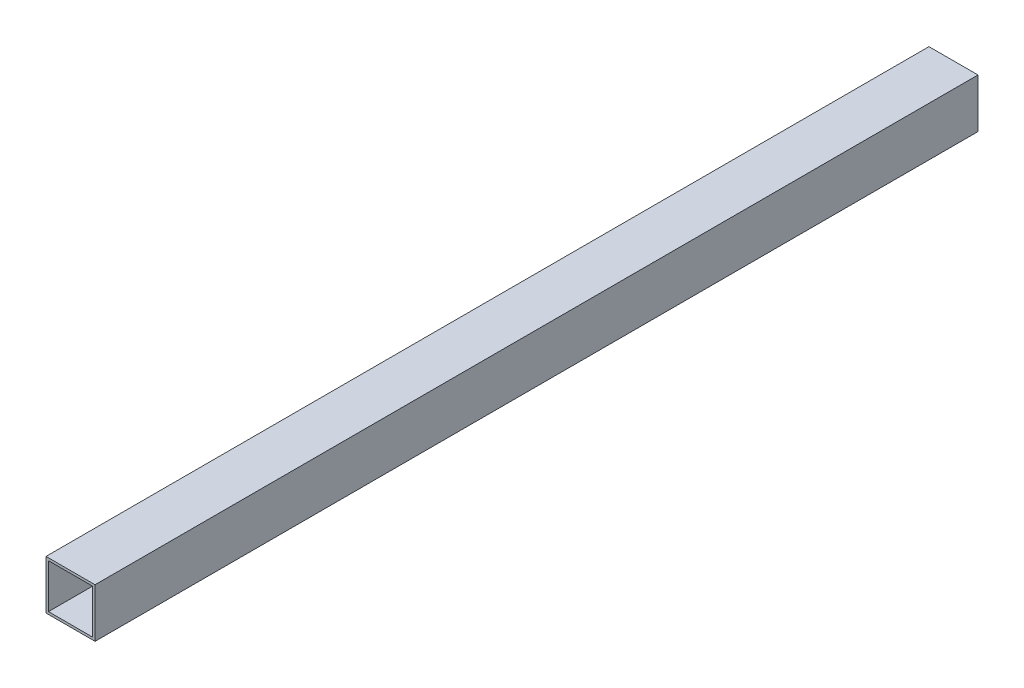
ISO-10303-21;
HEADER;
FILE_DESCRIPTION(('STEP AP214'),'2;1');
FILE_NAME('part.step','',(''),(''),'','','');
FILE_SCHEMA(('AUTOMOTIVE_DESIGN { 1 0 10303 214 1 1 1 1 }'));
ENDSEC;
DATA;
#1=APPLICATION_CONTEXT('core data for automotive mechanical design processes');
#2=APPLICATION_PROTOCOL_DEFINITION('international standard','automotive_design',2000,#1);
#3=PRODUCT_CONTEXT('',#1,'mechanical');
#4=PRODUCT('Part','Part','',(#3));
#5=PRODUCT_RELATED_PRODUCT_CATEGORY('part','',(#4));
#6=PRODUCT_DEFINITION_FORMATION('','',#4);
#7=PRODUCT_DEFINITION_CONTEXT('part definition',#1,'design');
#8=PRODUCT_DEFINITION('design','',#6,#7);
#9=PRODUCT_DEFINITION_SHAPE('','',#8);
#10=(LENGTH_UNIT() NAMED_UNIT(*) SI_UNIT(.MILLI.,.METRE.));
#11=(NAMED_UNIT(*) PLANE_ANGLE_UNIT() SI_UNIT($,.RADIAN.));
#12=(NAMED_UNIT(*) SI_UNIT($,.STERADIAN.) SOLID_ANGLE_UNIT());
#13=UNCERTAINTY_MEASURE_WITH_UNIT(LENGTH_MEASURE(1.E-05),#10,'distance_accuracy_value','');
#14=(GEOMETRIC_REPRESENTATION_CONTEXT(3) GLOBAL_UNCERTAINTY_ASSIGNED_CONTEXT((#13)) GLOBAL_UNIT_ASSIGNED_CONTEXT((#10,
#11,#12)) REPRESENTATION_CONTEXT('',''));
#15=CARTESIAN_POINT('',(0.,0.,0.));
#16=DIRECTION('',(0.,0.,1.));
#17=DIRECTION('',(1.,0.,0.));
#18=AXIS2_PLACEMENT_3D('',#15,#16,#17);
#19=CARTESIAN_POINT('',(0.,0.,360.));
#20=DIRECTION('',(0.,0.,1.));
#21=DIRECTION('',(1.,0.,0.));
#22=AXIS2_PLACEMENT_3D('',#19,#20,#21);
#23=PLANE('',#22);
#24=DIRECTION('',(0.,-1.,0.));
#25=VECTOR('',#24,1.);
#26=CARTESIAN_POINT('',(0.,0.,360.));
#27=LINE('',#26,#25);
#28=CARTESIAN_POINT('',(0.,0.,360.));
#29=VERTEX_POINT('',#28);
#30=CARTESIAN_POINT('',(0.,-20.,360.));
#31=VERTEX_POINT('',#30);
#32=EDGE_CURVE('E133',#29,#31,#27,.T.);
#33=ORIENTED_EDGE('',*,*,#32,.T.);
#34=DIRECTION('',(1.,0.,0.));
#35=VECTOR('',#34,1.);
#36=CARTESIAN_POINT('',(0.,-20.,360.));
#37=LINE('',#36,#35);
#38=CARTESIAN_POINT('',(20.,-20.,360.));
#39=VERTEX_POINT('',#38);
#40=EDGE_CURVE('E136',#31,#39,#37,.T.);
#41=ORIENTED_EDGE('',*,*,#40,.T.);
#42=DIRECTION('',(0.,1.,0.));
#43=VECTOR('',#42,1.);
#44=CARTESIAN_POINT('',(20.,0.,360.));
#45=LINE('',#44,#43);
#46=CARTESIAN_POINT('',(20.,0.,360.));
#47=VERTEX_POINT('',#46);
#48=EDGE_CURVE('E139',#39,#47,#45,.T.);
#49=ORIENTED_EDGE('',*,*,#48,.T.);
#50=DIRECTION('',(-1.,0.,0.));
#51=VECTOR('',#50,1.);
#52=CARTESIAN_POINT('',(0.,0.,360.));
#53=LINE('',#52,#51);
#54=EDGE_CURVE('E141',#47,#29,#53,.T.);
#55=ORIENTED_EDGE('',*,*,#54,.T.);
#56=EDGE_LOOP('',(#33,#41,#49,#55));
#57=FACE_BOUND('',#56,.T.);
#58=DIRECTION('',(-1.,0.,0.));
#59=VECTOR('',#58,1.);
#60=CARTESIAN_POINT('',(1.,-1.,360.));
#61=LINE('',#60,#59);
#62=CARTESIAN_POINT('',(19.,-1.,360.));
#63=VERTEX_POINT('',#62);
#64=CARTESIAN_POINT('',(1.,-1.,360.));
#65=VERTEX_POINT('',#64);
#66=EDGE_CURVE('E105',#63,#65,#61,.T.);
#67=ORIENTED_EDGE('',*,*,#66,.F.);
#68=DIRECTION('',(0.,1.,0.));
#69=VECTOR('',#68,1.);
#70=CARTESIAN_POINT('',(19.,-19.,360.));
#71=LINE('',#70,#69);
#72=CARTESIAN_POINT('',(19.,-19.,360.));
#73=VERTEX_POINT('',#72);
#74=EDGE_CURVE('E97',#73,#63,#71,.T.);
#75=ORIENTED_EDGE('',*,*,#74,.F.);
#76=DIRECTION('',(1.,0.,0.));
#77=VECTOR('',#76,1.);
#78=CARTESIAN_POINT('',(1.,-19.,360.));
#79=LINE('',#78,#77);
#80=CARTESIAN_POINT('',(1.,-19.,360.));
#81=VERTEX_POINT('',#80);
#82=EDGE_CURVE('E119',#81,#73,#79,.T.);
#83=ORIENTED_EDGE('',*,*,#82,.F.);
#84=DIRECTION('',(0.,-1.,0.));
#85=VECTOR('',#84,1.);
#86=CARTESIAN_POINT('',(1.,-19.,360.));
#87=LINE('',#86,#85);
#88=EDGE_CURVE('E117',#65,#81,#87,.T.);
#89=ORIENTED_EDGE('',*,*,#88,.F.);
#90=EDGE_LOOP('',(#67,#75,#83,#89));
#91=FACE_BOUND('',#90,.T.);
#92=ADVANCED_FACE('F32',(#57,#91),#23,.T.);
#93=CARTESIAN_POINT('',(0.,0.,0.));
#94=DIRECTION('',(0.,0.,1.));
#95=DIRECTION('',(1.,0.,0.));
#96=AXIS2_PLACEMENT_3D('',#93,#94,#95);
#97=PLANE('',#96);
#98=DIRECTION('',(0.,-1.,0.));
#99=VECTOR('',#98,1.);
#100=CARTESIAN_POINT('',(0.,0.,0.));
#101=LINE('',#100,#99);
#102=CARTESIAN_POINT('',(0.,0.,0.));
#103=VERTEX_POINT('',#102);
#104=CARTESIAN_POINT('',(0.,-20.,0.));
#105=VERTEX_POINT('',#104);
#106=EDGE_CURVE('E113',#103,#105,#101,.T.);
#107=ORIENTED_EDGE('',*,*,#106,.F.);
#108=DIRECTION('',(-1.,0.,0.));
#109=VECTOR('',#108,1.);
#110=CARTESIAN_POINT('',(0.,0.,0.));
#111=LINE('',#110,#109);
#112=CARTESIAN_POINT('',(20.,0.,0.));
#113=VERTEX_POINT('',#112);
#114=EDGE_CURVE('E137',#113,#103,#111,.T.);
#115=ORIENTED_EDGE('',*,*,#114,.F.);
#116=DIRECTION('',(0.,1.,0.));
#117=VECTOR('',#116,1.);
#118=CARTESIAN_POINT('',(20.,0.,0.));
#119=LINE('',#118,#117);
#120=CARTESIAN_POINT('',(20.,-20.,0.));
#121=VERTEX_POINT('',#120);
#122=EDGE_CURVE('E148',#121,#113,#119,.T.);
#123=ORIENTED_EDGE('',*,*,#122,.F.);
#124=DIRECTION('',(1.,0.,0.));
#125=VECTOR('',#124,1.);
#126=CARTESIAN_POINT('',(0.,-20.,0.));
#127=LINE('',#126,#125);
#128=EDGE_CURVE('E146',#105,#121,#127,.T.);
#129=ORIENTED_EDGE('',*,*,#128,.F.);
#130=EDGE_LOOP('',(#107,#115,#123,#129));
#131=FACE_BOUND('',#130,.T.);
#132=DIRECTION('',(0.,1.,0.));
#133=VECTOR('',#132,1.);
#134=CARTESIAN_POINT('',(19.,-19.,0.));
#135=LINE('',#134,#133);
#136=CARTESIAN_POINT('',(19.,-19.,0.));
#137=VERTEX_POINT('',#136);
#138=CARTESIAN_POINT('',(19.,-1.,0.));
#139=VERTEX_POINT('',#138);
#140=EDGE_CURVE('E55',#137,#139,#135,.T.);
#141=ORIENTED_EDGE('',*,*,#140,.T.);
#142=DIRECTION('',(-1.,0.,0.));
#143=VECTOR('',#142,1.);
#144=CARTESIAN_POINT('',(1.,-1.,0.));
#145=LINE('',#144,#143);
#146=CARTESIAN_POINT('',(1.,-1.,0.));
#147=VERTEX_POINT('',#146);
#148=EDGE_CURVE('E112',#139,#147,#145,.T.);
#149=ORIENTED_EDGE('',*,*,#148,.T.);
#150=DIRECTION('',(0.,-1.,0.));
#151=VECTOR('',#150,1.);
#152=CARTESIAN_POINT('',(1.,-19.,0.));
#153=LINE('',#152,#151);
#154=CARTESIAN_POINT('',(1.,-19.,0.));
#155=VERTEX_POINT('',#154);
#156=EDGE_CURVE('E125',#147,#155,#153,.T.);
#157=ORIENTED_EDGE('',*,*,#156,.T.);
#158=DIRECTION('',(1.,0.,0.));
#159=VECTOR('',#158,1.);
#160=CARTESIAN_POINT('',(1.,-19.,0.));
#161=LINE('',#160,#159);
#162=EDGE_CURVE('E106',#155,#137,#161,.T.);
#163=ORIENTED_EDGE('',*,*,#162,.T.);
#164=EDGE_LOOP('',(#141,#149,#157,#163));
#165=FACE_BOUND('',#164,.T.);
#166=ADVANCED_FACE('F166',(#131,#165),#97,.F.);
#167=CARTESIAN_POINT('',(0.,0.,360.));
#168=DIRECTION('',(1.,0.,0.));
#169=DIRECTION('',(0.,0.,-1.));
#170=AXIS2_PLACEMENT_3D('',#167,#168,#169);
#171=PLANE('',#170);
#172=ORIENTED_EDGE('',*,*,#106,.T.);
#173=DIRECTION('',(0.,0.,-1.));
#174=VECTOR('',#173,1.);
#175=CARTESIAN_POINT('',(0.,-20.,360.));
#176=LINE('',#175,#174);
#177=EDGE_CURVE('E11',#31,#105,#176,.T.);
#178=ORIENTED_EDGE('',*,*,#177,.F.);
#179=ORIENTED_EDGE('',*,*,#32,.F.);
#180=DIRECTION('',(0.,0.,-1.));
#181=VECTOR('',#180,1.);
#182=CARTESIAN_POINT('',(0.,0.,360.));
#183=LINE('',#182,#181);
#184=EDGE_CURVE('E143',#29,#103,#183,.T.);
#185=ORIENTED_EDGE('',*,*,#184,.T.);
#186=EDGE_LOOP('',(#172,#178,#179,#185));
#187=FACE_BOUND('',#186,.T.);
#188=ADVANCED_FACE('F34',(#187),#171,.F.);
#189=CARTESIAN_POINT('',(0.,-20.,360.));
#190=DIRECTION('',(0.,1.,0.));
#191=DIRECTION('',(0.,0.,1.));
#192=AXIS2_PLACEMENT_3D('',#189,#190,#191);
#193=PLANE('',#192);
#194=ORIENTED_EDGE('',*,*,#128,.T.);
#195=DIRECTION('',(0.,0.,-1.));
#196=VECTOR('',#195,1.);
#197=CARTESIAN_POINT('',(20.,-20.,360.));
#198=LINE('',#197,#196);
#199=EDGE_CURVE('E40',#39,#121,#198,.T.);
#200=ORIENTED_EDGE('',*,*,#199,.F.);
#201=ORIENTED_EDGE('',*,*,#40,.F.);
#202=ORIENTED_EDGE('',*,*,#177,.T.);
#203=EDGE_LOOP('',(#194,#200,#201,#202));
#204=FACE_BOUND('',#203,.T.);
#205=ADVANCED_FACE('F176',(#204),#193,.F.);
#206=CARTESIAN_POINT('',(20.,0.,360.));
#207=DIRECTION('',(-1.,0.,0.));
#208=DIRECTION('',(0.,-1.,0.));
#209=AXIS2_PLACEMENT_3D('',#206,#207,#208);
#210=PLANE('',#209);
#211=ORIENTED_EDGE('',*,*,#122,.T.);
#212=DIRECTION('',(0.,0.,-1.));
#213=VECTOR('',#212,1.);
#214=CARTESIAN_POINT('',(20.,0.,360.));
#215=LINE('',#214,#213);
#216=EDGE_CURVE('E153',#47,#113,#215,.T.);
#217=ORIENTED_EDGE('',*,*,#216,.F.);
#218=ORIENTED_EDGE('',*,*,#48,.F.);
#219=ORIENTED_EDGE('',*,*,#199,.T.);
#220=EDGE_LOOP('',(#211,#217,#218,#219));
#221=FACE_BOUND('',#220,.T.);
#222=ADVANCED_FACE('F160',(#221),#210,.F.);
#223=CARTESIAN_POINT('',(0.,0.,360.));
#224=DIRECTION('',(0.,-1.,0.));
#225=DIRECTION('',(0.,0.,-1.));
#226=AXIS2_PLACEMENT_3D('',#223,#224,#225);
#227=PLANE('',#226);
#228=ORIENTED_EDGE('',*,*,#114,.T.);
#229=ORIENTED_EDGE('',*,*,#184,.F.);
#230=ORIENTED_EDGE('',*,*,#54,.F.);
#231=ORIENTED_EDGE('',*,*,#216,.T.);
#232=EDGE_LOOP('',(#228,#229,#230,#231));
#233=FACE_BOUND('',#232,.T.);
#234=ADVANCED_FACE('F170',(#233),#227,.F.);
#235=CARTESIAN_POINT('',(19.,-19.,360.));
#236=DIRECTION('',(-1.,0.,0.));
#237=DIRECTION('',(0.,0.,1.));
#238=AXIS2_PLACEMENT_3D('',#235,#236,#237);
#239=PLANE('',#238);
#240=ORIENTED_EDGE('',*,*,#140,.F.);
#241=DIRECTION('',(0.,0.,-1.));
#242=VECTOR('',#241,1.);
#243=CARTESIAN_POINT('',(19.,-19.,360.));
#244=LINE('',#243,#242);
#245=EDGE_CURVE('E101',#73,#137,#244,.T.);
#246=ORIENTED_EDGE('',*,*,#245,.F.);
#247=ORIENTED_EDGE('',*,*,#74,.T.);
#248=DIRECTION('',(0.,0.,-1.));
#249=VECTOR('',#248,1.);
#250=CARTESIAN_POINT('',(19.,-1.,360.));
#251=LINE('',#250,#249);
#252=EDGE_CURVE('E100',#63,#139,#251,.T.);
#253=ORIENTED_EDGE('',*,*,#252,.T.);
#254=EDGE_LOOP('',(#240,#246,#247,#253));
#255=FACE_BOUND('',#254,.T.);
#256=ADVANCED_FACE('F99',(#255),#239,.T.);
#257=CARTESIAN_POINT('',(1.,-1.,360.));
#258=DIRECTION('',(0.,-1.,0.));
#259=DIRECTION('',(0.,0.,-1.));
#260=AXIS2_PLACEMENT_3D('',#257,#258,#259);
#261=PLANE('',#260);
#262=ORIENTED_EDGE('',*,*,#148,.F.);
#263=ORIENTED_EDGE('',*,*,#252,.F.);
#264=ORIENTED_EDGE('',*,*,#66,.T.);
#265=DIRECTION('',(0.,0.,-1.));
#266=VECTOR('',#265,1.);
#267=CARTESIAN_POINT('',(1.,-1.,360.));
#268=LINE('',#267,#266);
#269=EDGE_CURVE('E114',#65,#147,#268,.T.);
#270=ORIENTED_EDGE('',*,*,#269,.T.);
#271=EDGE_LOOP('',(#262,#263,#264,#270));
#272=FACE_BOUND('',#271,.T.);
#273=ADVANCED_FACE('F109',(#272),#261,.T.);
#274=CARTESIAN_POINT('',(1.,-19.,360.));
#275=DIRECTION('',(1.,0.,0.));
#276=DIRECTION('',(0.,0.,-1.));
#277=AXIS2_PLACEMENT_3D('',#274,#275,#276);
#278=PLANE('',#277);
#279=ORIENTED_EDGE('',*,*,#156,.F.);
#280=ORIENTED_EDGE('',*,*,#269,.F.);
#281=ORIENTED_EDGE('',*,*,#88,.T.);
#282=DIRECTION('',(0.,0.,-1.));
#283=VECTOR('',#282,1.);
#284=CARTESIAN_POINT('',(1.,-19.,360.));
#285=LINE('',#284,#283);
#286=EDGE_CURVE('E47',#81,#155,#285,.T.);
#287=ORIENTED_EDGE('',*,*,#286,.T.);
#288=EDGE_LOOP('',(#279,#280,#281,#287));
#289=FACE_BOUND('',#288,.T.);
#290=ADVANCED_FACE('F199',(#289),#278,.T.);
#291=CARTESIAN_POINT('',(1.,-19.,360.));
#292=DIRECTION('',(0.,1.,0.));
#293=DIRECTION('',(0.,0.,1.));
#294=AXIS2_PLACEMENT_3D('',#291,#292,#293);
#295=PLANE('',#294);
#296=ORIENTED_EDGE('',*,*,#162,.F.);
#297=ORIENTED_EDGE('',*,*,#286,.F.);
#298=ORIENTED_EDGE('',*,*,#82,.T.);
#299=ORIENTED_EDGE('',*,*,#245,.T.);
#300=EDGE_LOOP('',(#296,#297,#298,#299));
#301=FACE_BOUND('',#300,.T.);
#302=ADVANCED_FACE('F203',(#301),#295,.T.);
#303=CLOSED_SHELL('',(#92,#166,#188,#205,#222,#234,#256,#273,#290,#302));
#304=MANIFOLD_SOLID_BREP('B2',#303);
#305=ADVANCED_BREP_SHAPE_REPRESENTATION('',(#18,#304),#14);
#306=SHAPE_DEFINITION_REPRESENTATION(#9,#305);
ENDSEC;
END-ISO-10303-21;
